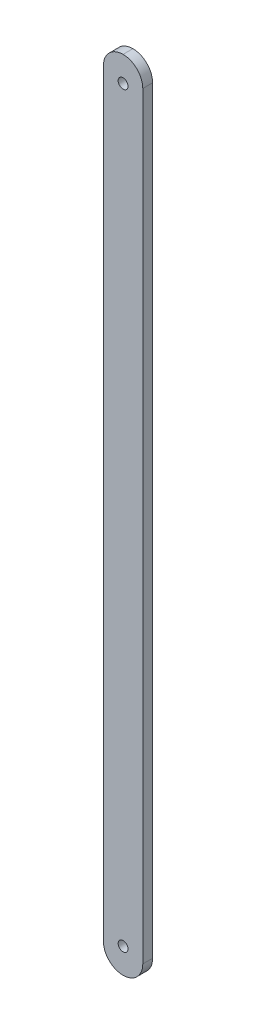
ISO-10303-21;
HEADER;
FILE_DESCRIPTION(('STEP AP214'),'2;1');
FILE_NAME('part.step','',(''),(''),'','','');
FILE_SCHEMA(('AUTOMOTIVE_DESIGN { 1 0 10303 214 1 1 1 1 }'));
ENDSEC;
DATA;
#1=APPLICATION_CONTEXT('core data for automotive mechanical design processes');
#2=APPLICATION_PROTOCOL_DEFINITION('international standard','automotive_design',2000,#1);
#3=PRODUCT_CONTEXT('',#1,'mechanical');
#4=PRODUCT('Part','Part','',(#3));
#5=PRODUCT_RELATED_PRODUCT_CATEGORY('part','',(#4));
#6=PRODUCT_DEFINITION_FORMATION('','',#4);
#7=PRODUCT_DEFINITION_CONTEXT('part definition',#1,'design');
#8=PRODUCT_DEFINITION('design','',#6,#7);
#9=PRODUCT_DEFINITION_SHAPE('','',#8);
#10=(LENGTH_UNIT() NAMED_UNIT(*) SI_UNIT(.MILLI.,.METRE.));
#11=(NAMED_UNIT(*) PLANE_ANGLE_UNIT() SI_UNIT($,.RADIAN.));
#12=(NAMED_UNIT(*) SI_UNIT($,.STERADIAN.) SOLID_ANGLE_UNIT());
#13=UNCERTAINTY_MEASURE_WITH_UNIT(LENGTH_MEASURE(1.E-05),#10,'distance_accuracy_value','');
#14=(GEOMETRIC_REPRESENTATION_CONTEXT(3) GLOBAL_UNCERTAINTY_ASSIGNED_CONTEXT((#13)) GLOBAL_UNIT_ASSIGNED_CONTEXT((#10,
#11,#12)) REPRESENTATION_CONTEXT('',''));
#15=CARTESIAN_POINT('',(0.,0.,0.));
#16=DIRECTION('',(0.,0.,1.));
#17=DIRECTION('',(1.,0.,0.));
#18=AXIS2_PLACEMENT_3D('',#15,#16,#17);
#19=CARTESIAN_POINT('',(-25.4000000000001,257.175,6.35));
#20=DIRECTION('',(1.,0.,0.));
#21=DIRECTION('',(0.,1.,0.));
#22=AXIS2_PLACEMENT_3D('',#19,#20,#21);
#23=PLANE('',#22);
#24=DIRECTION('',(0.,-1.,0.));
#25=VECTOR('',#24,1.);
#26=CARTESIAN_POINT('',(-25.4000000000001,257.175,0.));
#27=LINE('',#26,#25);
#28=CARTESIAN_POINT('',(-25.4000000000001,244.475,0.));
#29=VERTEX_POINT('',#28);
#30=CARTESIAN_POINT('',(-25.3999999999999,-244.475,0.));
#31=VERTEX_POINT('',#30);
#32=EDGE_CURVE('E103',#29,#31,#27,.T.);
#33=ORIENTED_EDGE('',*,*,#32,.T.);
#34=DIRECTION('',(0.,0.,-1.));
#35=VECTOR('',#34,1.);
#36=CARTESIAN_POINT('',(-25.3999999999999,-244.475,6.35));
#37=LINE('',#36,#35);
#38=CARTESIAN_POINT('',(-25.3999999999999,-244.475,6.35));
#39=VERTEX_POINT('',#38);
#40=EDGE_CURVE('E128',#31,#39,#37,.F.);
#41=ORIENTED_EDGE('',*,*,#40,.T.);
#42=DIRECTION('',(0.,-1.,0.));
#43=VECTOR('',#42,1.);
#44=CARTESIAN_POINT('',(-25.4000000000001,257.175,6.35));
#45=LINE('',#44,#43);
#46=CARTESIAN_POINT('',(-25.4000000000001,244.475,6.35));
#47=VERTEX_POINT('',#46);
#48=EDGE_CURVE('E105',#47,#39,#45,.T.);
#49=ORIENTED_EDGE('',*,*,#48,.F.);
#50=DIRECTION('',(0.,0.,-1.));
#51=VECTOR('',#50,1.);
#52=CARTESIAN_POINT('',(-25.4000000000001,244.475,6.35));
#53=LINE('',#52,#51);
#54=EDGE_CURVE('E89',#47,#29,#53,.T.);
#55=ORIENTED_EDGE('',*,*,#54,.T.);
#56=EDGE_LOOP('',(#33,#41,#49,#55));
#57=FACE_BOUND('',#56,.T.);
#58=ADVANCED_FACE('F35',(#57),#23,.F.);
#59=CARTESIAN_POINT('',(-1.11022302462516E-13,257.175,6.35));
#60=DIRECTION('',(-1.,0.,0.));
#61=DIRECTION('',(0.,-1.,0.));
#62=AXIS2_PLACEMENT_3D('',#59,#60,#61);
#63=PLANE('',#62);
#64=DIRECTION('',(0.,1.,0.));
#65=VECTOR('',#64,1.);
#66=CARTESIAN_POINT('',(-1.11022302462516E-13,257.175,6.35));
#67=LINE('',#66,#65);
#68=CARTESIAN_POINT('',(0.,-244.475,6.35));
#69=VERTEX_POINT('',#68);
#70=CARTESIAN_POINT('',(-1.06910365334274E-13,244.475,6.35));
#71=VERTEX_POINT('',#70);
#72=EDGE_CURVE('E106',#69,#71,#67,.T.);
#73=ORIENTED_EDGE('',*,*,#72,.F.);
#74=DIRECTION('',(0.,0.,-1.));
#75=VECTOR('',#74,1.);
#76=CARTESIAN_POINT('',(0.,-244.475,6.35));
#77=LINE('',#76,#75);
#78=CARTESIAN_POINT('',(0.,-244.475,0.));
#79=VERTEX_POINT('',#78);
#80=EDGE_CURVE('E11',#69,#79,#77,.T.);
#81=ORIENTED_EDGE('',*,*,#80,.T.);
#82=DIRECTION('',(0.,1.,0.));
#83=VECTOR('',#82,1.);
#84=CARTESIAN_POINT('',(-1.11022302462516E-13,257.175,0.));
#85=LINE('',#84,#83);
#86=CARTESIAN_POINT('',(-1.06910365334274E-13,244.475,0.));
#87=VERTEX_POINT('',#86);
#88=EDGE_CURVE('E111',#79,#87,#85,.T.);
#89=ORIENTED_EDGE('',*,*,#88,.T.);
#90=DIRECTION('',(0.,0.,-1.));
#91=VECTOR('',#90,1.);
#92=CARTESIAN_POINT('',(-1.06910365334274E-13,244.475,6.35));
#93=LINE('',#92,#91);
#94=EDGE_CURVE('E122',#87,#71,#93,.F.);
#95=ORIENTED_EDGE('',*,*,#94,.T.);
#96=EDGE_LOOP('',(#73,#81,#89,#95));
#97=FACE_BOUND('',#96,.T.);
#98=ADVANCED_FACE('F155',(#97),#63,.F.);
#99=CARTESIAN_POINT('',(0.,0.,6.35));
#100=DIRECTION('',(0.,0.,1.));
#101=DIRECTION('',(1.,0.,0.));
#102=AXIS2_PLACEMENT_3D('',#99,#100,#101);
#103=PLANE('',#102);
#104=CARTESIAN_POINT('',(-12.6999999999999,240.919,6.35));
#105=DIRECTION('',(0.,0.,1.));
#106=DIRECTION('',(1.,0.,0.));
#107=AXIS2_PLACEMENT_3D('',#104,#105,#106);
#108=CIRCLE('',#107,3.175);
#109=CARTESIAN_POINT('',(-9.52499999999991,240.919,6.35));
#110=VERTEX_POINT('',#109);
#111=EDGE_CURVE('E140',#110,#110,#108,.T.);
#112=ORIENTED_EDGE('',*,*,#111,.F.);
#113=EDGE_LOOP('',(#112));
#114=FACE_BOUND('',#113,.T.);
#115=CARTESIAN_POINT('',(-12.6999999999999,-240.919,6.35));
#116=DIRECTION('',(0.,0.,1.));
#117=DIRECTION('',(1.,0.,0.));
#118=AXIS2_PLACEMENT_3D('',#115,#116,#117);
#119=CIRCLE('',#118,3.175);
#120=CARTESIAN_POINT('',(-9.52499999999991,-240.919,6.35));
#121=VERTEX_POINT('',#120);
#122=EDGE_CURVE('E134',#121,#121,#119,.T.);
#123=ORIENTED_EDGE('',*,*,#122,.F.);
#124=EDGE_LOOP('',(#123));
#125=FACE_BOUND('',#124,.T.);
#126=ORIENTED_EDGE('',*,*,#48,.T.);
#127=CARTESIAN_POINT('',(-12.6999999999999,-244.475,6.35));
#128=DIRECTION('',(0.,0.,1.));
#129=DIRECTION('',(1.,0.,0.));
#130=AXIS2_PLACEMENT_3D('',#127,#128,#129);
#131=CIRCLE('',#130,12.7);
#132=CARTESIAN_POINT('',(-12.6999999999999,-257.175,6.35));
#133=VERTEX_POINT('',#132);
#134=EDGE_CURVE('E44',#39,#133,#131,.T.);
#135=ORIENTED_EDGE('',*,*,#134,.T.);
#136=CARTESIAN_POINT('',(-12.6999999999999,-244.475,6.35));
#137=DIRECTION('',(0.,0.,1.));
#138=DIRECTION('',(1.,0.,0.));
#139=AXIS2_PLACEMENT_3D('',#136,#137,#138);
#140=CIRCLE('',#139,12.7);
#141=EDGE_CURVE('E51',#133,#69,#140,.T.);
#142=ORIENTED_EDGE('',*,*,#141,.T.);
#143=ORIENTED_EDGE('',*,*,#72,.T.);
#144=CARTESIAN_POINT('',(-12.7000000000001,244.475,6.35));
#145=DIRECTION('',(0.,0.,1.));
#146=DIRECTION('',(1.,0.,0.));
#147=AXIS2_PLACEMENT_3D('',#144,#145,#146);
#148=CIRCLE('',#147,12.7);
#149=CARTESIAN_POINT('',(-12.7000000000001,257.175,6.35));
#150=VERTEX_POINT('',#149);
#151=EDGE_CURVE('E96',#71,#150,#148,.T.);
#152=ORIENTED_EDGE('',*,*,#151,.T.);
#153=CARTESIAN_POINT('',(-12.7000000000001,244.475,6.35));
#154=DIRECTION('',(0.,0.,1.));
#155=DIRECTION('',(1.,0.,0.));
#156=AXIS2_PLACEMENT_3D('',#153,#154,#155);
#157=CIRCLE('',#156,12.7);
#158=EDGE_CURVE('E120',#150,#47,#157,.T.);
#159=ORIENTED_EDGE('',*,*,#158,.T.);
#160=EDGE_LOOP('',(#126,#135,#142,#143,#152,#159));
#161=FACE_BOUND('',#160,.T.);
#162=ADVANCED_FACE('F132',(#114,#125,#161),#103,.T.);
#163=CARTESIAN_POINT('',(0.,0.,0.));
#164=DIRECTION('',(0.,0.,1.));
#165=DIRECTION('',(1.,0.,0.));
#166=AXIS2_PLACEMENT_3D('',#163,#164,#165);
#167=PLANE('',#166);
#168=CARTESIAN_POINT('',(-12.6999999999999,240.919,0.));
#169=DIRECTION('',(0.,0.,1.));
#170=DIRECTION('',(1.,0.,0.));
#171=AXIS2_PLACEMENT_3D('',#168,#169,#170);
#172=CIRCLE('',#171,3.175);
#173=CARTESIAN_POINT('',(-9.52499999999991,240.919,0.));
#174=VERTEX_POINT('',#173);
#175=EDGE_CURVE('E143',#174,#174,#172,.T.);
#176=ORIENTED_EDGE('',*,*,#175,.T.);
#177=EDGE_LOOP('',(#176));
#178=FACE_BOUND('',#177,.T.);
#179=CARTESIAN_POINT('',(-12.6999999999999,-240.919,0.));
#180=DIRECTION('',(0.,0.,1.));
#181=DIRECTION('',(1.,0.,0.));
#182=AXIS2_PLACEMENT_3D('',#179,#180,#181);
#183=CIRCLE('',#182,3.175);
#184=CARTESIAN_POINT('',(-9.52499999999991,-240.919,0.));
#185=VERTEX_POINT('',#184);
#186=EDGE_CURVE('E137',#185,#185,#183,.T.);
#187=ORIENTED_EDGE('',*,*,#186,.T.);
#188=EDGE_LOOP('',(#187));
#189=FACE_BOUND('',#188,.T.);
#190=CARTESIAN_POINT('',(-12.6999999999999,-244.475,0.));
#191=DIRECTION('',(0.,0.,1.));
#192=DIRECTION('',(1.,0.,0.));
#193=AXIS2_PLACEMENT_3D('',#190,#191,#192);
#194=CIRCLE('',#193,12.7);
#195=CARTESIAN_POINT('',(-12.6999999999999,-257.175,0.));
#196=VERTEX_POINT('',#195);
#197=EDGE_CURVE('E124',#79,#196,#194,.F.);
#198=ORIENTED_EDGE('',*,*,#197,.T.);
#199=CARTESIAN_POINT('',(-12.6999999999999,-244.475,0.));
#200=DIRECTION('',(0.,0.,1.));
#201=DIRECTION('',(1.,0.,0.));
#202=AXIS2_PLACEMENT_3D('',#199,#200,#201);
#203=CIRCLE('',#202,12.7);
#204=EDGE_CURVE('E110',#196,#31,#203,.F.);
#205=ORIENTED_EDGE('',*,*,#204,.T.);
#206=ORIENTED_EDGE('',*,*,#32,.F.);
#207=CARTESIAN_POINT('',(-12.7000000000001,244.475,0.));
#208=DIRECTION('',(0.,0.,1.));
#209=DIRECTION('',(1.,0.,0.));
#210=AXIS2_PLACEMENT_3D('',#207,#208,#209);
#211=CIRCLE('',#210,12.7);
#212=CARTESIAN_POINT('',(-12.7000000000001,257.175,0.));
#213=VERTEX_POINT('',#212);
#214=EDGE_CURVE('E85',#29,#213,#211,.F.);
#215=ORIENTED_EDGE('',*,*,#214,.T.);
#216=CARTESIAN_POINT('',(-12.7000000000001,244.475,0.));
#217=DIRECTION('',(0.,0.,1.));
#218=DIRECTION('',(1.,0.,0.));
#219=AXIS2_PLACEMENT_3D('',#216,#217,#218);
#220=CIRCLE('',#219,12.7);
#221=EDGE_CURVE('E97',#213,#87,#220,.F.);
#222=ORIENTED_EDGE('',*,*,#221,.T.);
#223=ORIENTED_EDGE('',*,*,#88,.F.);
#224=EDGE_LOOP('',(#198,#205,#206,#215,#222,#223));
#225=FACE_BOUND('',#224,.T.);
#226=ADVANCED_FACE('F108',(#178,#189,#225),#167,.F.);
#227=CARTESIAN_POINT('',(-12.7000000000001,244.475,6.35));
#228=DIRECTION('',(0.,0.,-1.));
#229=DIRECTION('',(-1.,0.,0.));
#230=AXIS2_PLACEMENT_3D('',#227,#228,#229);
#231=CYLINDRICAL_SURFACE('',#230,12.7);
#232=DIRECTION('',(0.,0.,-1.));
#233=VECTOR('',#232,1.);
#234=CARTESIAN_POINT('',(-12.7000000000001,257.175,6.35));
#235=LINE('',#234,#233);
#236=EDGE_CURVE('E91',#150,#213,#235,.T.);
#237=ORIENTED_EDGE('',*,*,#236,.F.);
#238=ORIENTED_EDGE('',*,*,#151,.F.);
#239=ORIENTED_EDGE('',*,*,#94,.F.);
#240=ORIENTED_EDGE('',*,*,#221,.F.);
#241=EDGE_LOOP('',(#237,#238,#239,#240));
#242=FACE_BOUND('',#241,.T.);
#243=ADVANCED_FACE('F159',(#242),#231,.T.);
#244=CARTESIAN_POINT('',(-12.7000000000001,244.475,6.35));
#245=DIRECTION('',(0.,0.,-1.));
#246=DIRECTION('',(-1.,0.,0.));
#247=AXIS2_PLACEMENT_3D('',#244,#245,#246);
#248=CYLINDRICAL_SURFACE('',#247,12.7);
#249=ORIENTED_EDGE('',*,*,#158,.F.);
#250=ORIENTED_EDGE('',*,*,#236,.T.);
#251=ORIENTED_EDGE('',*,*,#214,.F.);
#252=ORIENTED_EDGE('',*,*,#54,.F.);
#253=EDGE_LOOP('',(#249,#250,#251,#252));
#254=FACE_BOUND('',#253,.T.);
#255=ADVANCED_FACE('F88',(#254),#248,.T.);
#256=CARTESIAN_POINT('',(-12.6999999999999,-244.475,6.35));
#257=DIRECTION('',(0.,0.,-1.));
#258=DIRECTION('',(-1.,0.,0.));
#259=AXIS2_PLACEMENT_3D('',#256,#257,#258);
#260=CYLINDRICAL_SURFACE('',#259,12.7);
#261=ORIENTED_EDGE('',*,*,#80,.F.);
#262=ORIENTED_EDGE('',*,*,#141,.F.);
#263=DIRECTION('',(0.,0.,-1.));
#264=VECTOR('',#263,1.);
#265=CARTESIAN_POINT('',(-12.6999999999999,-257.175,6.35));
#266=LINE('',#265,#264);
#267=EDGE_CURVE('E39',#196,#133,#266,.F.);
#268=ORIENTED_EDGE('',*,*,#267,.F.);
#269=ORIENTED_EDGE('',*,*,#197,.F.);
#270=EDGE_LOOP('',(#261,#262,#268,#269));
#271=FACE_BOUND('',#270,.T.);
#272=ADVANCED_FACE('F37',(#271),#260,.T.);
#273=CARTESIAN_POINT('',(-12.6999999999999,-244.475,6.35));
#274=DIRECTION('',(0.,0.,-1.));
#275=DIRECTION('',(-1.,0.,0.));
#276=AXIS2_PLACEMENT_3D('',#273,#274,#275);
#277=CYLINDRICAL_SURFACE('',#276,12.7);
#278=ORIENTED_EDGE('',*,*,#134,.F.);
#279=ORIENTED_EDGE('',*,*,#40,.F.);
#280=ORIENTED_EDGE('',*,*,#204,.F.);
#281=ORIENTED_EDGE('',*,*,#267,.T.);
#282=EDGE_LOOP('',(#278,#279,#280,#281));
#283=FACE_BOUND('',#282,.T.);
#284=ADVANCED_FACE('F149',(#283),#277,.T.);
#285=CARTESIAN_POINT('',(-12.6999999999999,-240.919,0.));
#286=DIRECTION('',(0.,0.,1.));
#287=DIRECTION('',(1.,0.,0.));
#288=AXIS2_PLACEMENT_3D('',#285,#286,#287);
#289=CYLINDRICAL_SURFACE('',#288,3.175);
#290=ORIENTED_EDGE('',*,*,#186,.F.);
#291=EDGE_LOOP('',(#290));
#292=FACE_BOUND('',#291,.T.);
#293=ORIENTED_EDGE('',*,*,#122,.T.);
#294=EDGE_LOOP('',(#293));
#295=FACE_BOUND('',#294,.T.);
#296=ADVANCED_FACE('F178',(#292,#295),#289,.F.);
#297=CARTESIAN_POINT('',(-12.6999999999999,240.919,0.));
#298=DIRECTION('',(0.,0.,1.));
#299=DIRECTION('',(1.,0.,0.));
#300=AXIS2_PLACEMENT_3D('',#297,#298,#299);
#301=CYLINDRICAL_SURFACE('',#300,3.175);
#302=ORIENTED_EDGE('',*,*,#175,.F.);
#303=EDGE_LOOP('',(#302));
#304=FACE_BOUND('',#303,.T.);
#305=ORIENTED_EDGE('',*,*,#111,.T.);
#306=EDGE_LOOP('',(#305));
#307=FACE_BOUND('',#306,.T.);
#308=ADVANCED_FACE('F181',(#304,#307),#301,.F.);
#309=CLOSED_SHELL('',(#58,#98,#162,#226,#243,#255,#272,#284,#296,#308));
#310=MANIFOLD_SOLID_BREP('B2',#309);
#311=ADVANCED_BREP_SHAPE_REPRESENTATION('',(#18,#310),#14);
#312=SHAPE_DEFINITION_REPRESENTATION(#9,#311);
ENDSEC;
END-ISO-10303-21;
